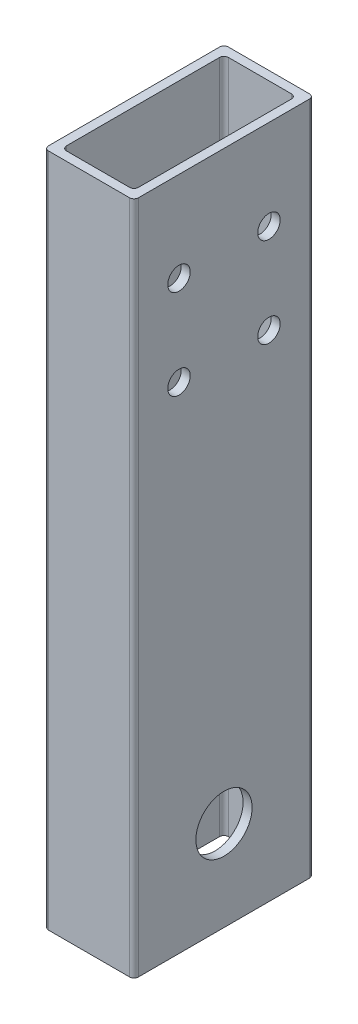
ISO-10303-21;
HEADER;
FILE_DESCRIPTION(('STEP AP214'),'2;1');
FILE_NAME('part.step','',(''),(''),'','','');
FILE_SCHEMA(('AUTOMOTIVE_DESIGN { 1 0 10303 214 1 1 1 1 }'));
ENDSEC;
DATA;
#1=APPLICATION_CONTEXT('core data for automotive mechanical design processes');
#2=APPLICATION_PROTOCOL_DEFINITION('international standard','automotive_design',2000,#1);
#3=PRODUCT_CONTEXT('',#1,'mechanical');
#4=PRODUCT('Part','Part','',(#3));
#5=PRODUCT_RELATED_PRODUCT_CATEGORY('part','',(#4));
#6=PRODUCT_DEFINITION_FORMATION('','',#4);
#7=PRODUCT_DEFINITION_CONTEXT('part definition',#1,'design');
#8=PRODUCT_DEFINITION('design','',#6,#7);
#9=PRODUCT_DEFINITION_SHAPE('','',#8);
#10=(LENGTH_UNIT() NAMED_UNIT(*) SI_UNIT(.MILLI.,.METRE.));
#11=(NAMED_UNIT(*) PLANE_ANGLE_UNIT() SI_UNIT($,.RADIAN.));
#12=(NAMED_UNIT(*) SI_UNIT($,.STERADIAN.) SOLID_ANGLE_UNIT());
#13=UNCERTAINTY_MEASURE_WITH_UNIT(LENGTH_MEASURE(1.E-05),#10,'distance_accuracy_value','');
#14=(GEOMETRIC_REPRESENTATION_CONTEXT(3) GLOBAL_UNCERTAINTY_ASSIGNED_CONTEXT((#13)) GLOBAL_UNIT_ASSIGNED_CONTEXT((#10,
#11,#12)) REPRESENTATION_CONTEXT('',''));
#15=CARTESIAN_POINT('',(0.,0.,0.));
#16=DIRECTION('',(0.,0.,1.));
#17=DIRECTION('',(1.,0.,0.));
#18=AXIS2_PLACEMENT_3D('',#15,#16,#17);
#19=CARTESIAN_POINT('',(2.,300.,-2.));
#20=DIRECTION('',(0.,-1.,0.));
#21=DIRECTION('',(0.,0.,-1.));
#22=AXIS2_PLACEMENT_3D('',#19,#20,#21);
#23=PLANE('',#22);
#24=CARTESIAN_POINT('',(2.,300.,-2.));
#25=DIRECTION('',(0.,1.,0.));
#26=DIRECTION('',(0.,0.,-1.));
#27=AXIS2_PLACEMENT_3D('',#24,#25,#26);
#28=CIRCLE('',#27,2.);
#29=CARTESIAN_POINT('',(0.,300.,-2.00000000000001));
#30=VERTEX_POINT('',#29);
#31=CARTESIAN_POINT('',(2.00000000000001,300.,0.));
#32=VERTEX_POINT('',#31);
#33=EDGE_CURVE('E219',#30,#32,#28,.T.);
#34=ORIENTED_EDGE('',*,*,#33,.T.);
#35=DIRECTION('',(1.,0.,0.));
#36=VECTOR('',#35,1.);
#37=CARTESIAN_POINT('',(2.00000000000001,300.,0.));
#38=LINE('',#37,#36);
#39=CARTESIAN_POINT('',(38.,300.,0.));
#40=VERTEX_POINT('',#39);
#41=EDGE_CURVE('E222',#32,#40,#38,.T.);
#42=ORIENTED_EDGE('',*,*,#41,.T.);
#43=CARTESIAN_POINT('',(38.,300.,-2.));
#44=DIRECTION('',(0.,1.,0.));
#45=DIRECTION('',(0.,0.,-1.));
#46=AXIS2_PLACEMENT_3D('',#43,#44,#45);
#47=CIRCLE('',#46,2.);
#48=CARTESIAN_POINT('',(40.,300.,-2.00000000000001));
#49=VERTEX_POINT('',#48);
#50=EDGE_CURVE('E225',#40,#49,#47,.T.);
#51=ORIENTED_EDGE('',*,*,#50,.T.);
#52=DIRECTION('',(0.,0.,-1.));
#53=VECTOR('',#52,1.);
#54=CARTESIAN_POINT('',(40.,300.,-2.00000000000001));
#55=LINE('',#54,#53);
#56=CARTESIAN_POINT('',(40.,300.,-78.));
#57=VERTEX_POINT('',#56);
#58=EDGE_CURVE('E227',#49,#57,#55,.T.);
#59=ORIENTED_EDGE('',*,*,#58,.T.);
#60=CARTESIAN_POINT('',(38.,300.,-78.));
#61=DIRECTION('',(0.,1.,0.));
#62=DIRECTION('',(0.,0.,-1.));
#63=AXIS2_PLACEMENT_3D('',#60,#61,#62);
#64=CIRCLE('',#63,2.);
#65=CARTESIAN_POINT('',(38.,300.,-80.));
#66=VERTEX_POINT('',#65);
#67=EDGE_CURVE('E229',#57,#66,#64,.T.);
#68=ORIENTED_EDGE('',*,*,#67,.T.);
#69=DIRECTION('',(-1.,0.,0.));
#70=VECTOR('',#69,1.);
#71=CARTESIAN_POINT('',(2.,300.,-80.));
#72=LINE('',#71,#70);
#73=CARTESIAN_POINT('',(2.,300.,-80.));
#74=VERTEX_POINT('',#73);
#75=EDGE_CURVE('E231',#66,#74,#72,.T.);
#76=ORIENTED_EDGE('',*,*,#75,.T.);
#77=CARTESIAN_POINT('',(2.,300.,-78.));
#78=DIRECTION('',(0.,1.,0.));
#79=DIRECTION('',(0.,0.,-1.));
#80=AXIS2_PLACEMENT_3D('',#77,#78,#79);
#81=CIRCLE('',#80,2.);
#82=CARTESIAN_POINT('',(0.,300.,-78.));
#83=VERTEX_POINT('',#82);
#84=EDGE_CURVE('E233',#74,#83,#81,.T.);
#85=ORIENTED_EDGE('',*,*,#84,.T.);
#86=DIRECTION('',(0.,0.,1.));
#87=VECTOR('',#86,1.);
#88=CARTESIAN_POINT('',(0.,300.,-2.00000000000001));
#89=LINE('',#88,#87);
#90=EDGE_CURVE('E235',#83,#30,#89,.T.);
#91=ORIENTED_EDGE('',*,*,#90,.T.);
#92=EDGE_LOOP('',(#34,#42,#51,#59,#68,#76,#85,#91));
#93=FACE_BOUND('',#92,.T.);
#94=CARTESIAN_POINT('',(34.,300.,-6.));
#95=DIRECTION('',(0.,1.,0.));
#96=DIRECTION('',(0.,0.,1.));
#97=AXIS2_PLACEMENT_3D('',#94,#95,#96);
#98=CIRCLE('',#97,2.);
#99=CARTESIAN_POINT('',(34.,300.,-4.));
#100=VERTEX_POINT('',#99);
#101=CARTESIAN_POINT('',(36.,300.,-6.00000000000001));
#102=VERTEX_POINT('',#101);
#103=EDGE_CURVE('E152',#100,#102,#98,.T.);
#104=ORIENTED_EDGE('',*,*,#103,.F.);
#105=DIRECTION('',(1.,0.,0.));
#106=VECTOR('',#105,1.);
#107=CARTESIAN_POINT('',(6.00000000000001,300.,-4.));
#108=LINE('',#107,#106);
#109=CARTESIAN_POINT('',(6.00000000000001,300.,-4.));
#110=VERTEX_POINT('',#109);
#111=EDGE_CURVE('E186',#110,#100,#108,.T.);
#112=ORIENTED_EDGE('',*,*,#111,.F.);
#113=CARTESIAN_POINT('',(6.,300.,-6.));
#114=DIRECTION('',(0.,1.,0.));
#115=DIRECTION('',(0.,0.,1.));
#116=AXIS2_PLACEMENT_3D('',#113,#114,#115);
#117=CIRCLE('',#116,2.);
#118=CARTESIAN_POINT('',(4.,300.,-6.00000000000002));
#119=VERTEX_POINT('',#118);
#120=EDGE_CURVE('E184',#119,#110,#117,.T.);
#121=ORIENTED_EDGE('',*,*,#120,.F.);
#122=DIRECTION('',(0.,0.,1.));
#123=VECTOR('',#122,1.);
#124=CARTESIAN_POINT('',(4.,300.,-6.00000000000001));
#125=LINE('',#124,#123);
#126=CARTESIAN_POINT('',(4.,300.,-74.));
#127=VERTEX_POINT('',#126);
#128=EDGE_CURVE('E182',#127,#119,#125,.T.);
#129=ORIENTED_EDGE('',*,*,#128,.F.);
#130=CARTESIAN_POINT('',(6.,300.,-74.));
#131=DIRECTION('',(0.,1.,0.));
#132=DIRECTION('',(0.,0.,1.));
#133=AXIS2_PLACEMENT_3D('',#130,#131,#132);
#134=CIRCLE('',#133,2.);
#135=CARTESIAN_POINT('',(6.,300.,-76.));
#136=VERTEX_POINT('',#135);
#137=EDGE_CURVE('E180',#136,#127,#134,.T.);
#138=ORIENTED_EDGE('',*,*,#137,.F.);
#139=DIRECTION('',(-1.,0.,0.));
#140=VECTOR('',#139,1.);
#141=CARTESIAN_POINT('',(6.,300.,-76.));
#142=LINE('',#141,#140);
#143=CARTESIAN_POINT('',(34.,300.,-76.));
#144=VERTEX_POINT('',#143);
#145=EDGE_CURVE('E175',#144,#136,#142,.T.);
#146=ORIENTED_EDGE('',*,*,#145,.F.);
#147=CARTESIAN_POINT('',(34.,300.,-74.));
#148=DIRECTION('',(0.,1.,0.));
#149=DIRECTION('',(0.,0.,1.));
#150=AXIS2_PLACEMENT_3D('',#147,#148,#149);
#151=CIRCLE('',#150,2.);
#152=CARTESIAN_POINT('',(36.,300.,-74.));
#153=VERTEX_POINT('',#152);
#154=EDGE_CURVE('E173',#153,#144,#151,.T.);
#155=ORIENTED_EDGE('',*,*,#154,.F.);
#156=DIRECTION('',(0.,0.,-1.));
#157=VECTOR('',#156,1.);
#158=CARTESIAN_POINT('',(36.,300.,-6.00000000000001));
#159=LINE('',#158,#157);
#160=EDGE_CURVE('E160',#102,#153,#159,.T.);
#161=ORIENTED_EDGE('',*,*,#160,.F.);
#162=EDGE_LOOP('',(#104,#112,#121,#129,#138,#146,#155,#161));
#163=FACE_BOUND('',#162,.T.);
#164=ADVANCED_FACE('F37',(#93,#163),#23,.F.);
#165=CARTESIAN_POINT('',(2.,0.,-2.));
#166=DIRECTION('',(0.,-1.,0.));
#167=DIRECTION('',(0.,0.,-1.));
#168=AXIS2_PLACEMENT_3D('',#165,#166,#167);
#169=PLANE('',#168);
#170=CARTESIAN_POINT('',(2.,0.,-2.));
#171=DIRECTION('',(0.,1.,0.));
#172=DIRECTION('',(0.,0.,-1.));
#173=AXIS2_PLACEMENT_3D('',#170,#171,#172);
#174=CIRCLE('',#173,2.);
#175=CARTESIAN_POINT('',(0.,0.,-2.00000000000001));
#176=VERTEX_POINT('',#175);
#177=CARTESIAN_POINT('',(2.00000000000001,0.,0.));
#178=VERTEX_POINT('',#177);
#179=EDGE_CURVE('E168',#176,#178,#174,.T.);
#180=ORIENTED_EDGE('',*,*,#179,.F.);
#181=DIRECTION('',(0.,0.,1.));
#182=VECTOR('',#181,1.);
#183=CARTESIAN_POINT('',(0.,0.,-2.00000000000001));
#184=LINE('',#183,#182);
#185=CARTESIAN_POINT('',(0.,0.,-78.));
#186=VERTEX_POINT('',#185);
#187=EDGE_CURVE('E223',#186,#176,#184,.T.);
#188=ORIENTED_EDGE('',*,*,#187,.F.);
#189=CARTESIAN_POINT('',(2.,0.,-78.));
#190=DIRECTION('',(0.,1.,0.));
#191=DIRECTION('',(0.,0.,-1.));
#192=AXIS2_PLACEMENT_3D('',#189,#190,#191);
#193=CIRCLE('',#192,2.);
#194=CARTESIAN_POINT('',(2.,0.,-80.));
#195=VERTEX_POINT('',#194);
#196=EDGE_CURVE('E250',#195,#186,#193,.T.);
#197=ORIENTED_EDGE('',*,*,#196,.F.);
#198=DIRECTION('',(-1.,0.,0.));
#199=VECTOR('',#198,1.);
#200=CARTESIAN_POINT('',(2.,0.,-80.));
#201=LINE('',#200,#199);
#202=CARTESIAN_POINT('',(38.,0.,-80.));
#203=VERTEX_POINT('',#202);
#204=EDGE_CURVE('E248',#203,#195,#201,.T.);
#205=ORIENTED_EDGE('',*,*,#204,.F.);
#206=CARTESIAN_POINT('',(38.,0.,-78.));
#207=DIRECTION('',(0.,1.,0.));
#208=DIRECTION('',(0.,0.,-1.));
#209=AXIS2_PLACEMENT_3D('',#206,#207,#208);
#210=CIRCLE('',#209,2.);
#211=CARTESIAN_POINT('',(40.,0.,-78.));
#212=VERTEX_POINT('',#211);
#213=EDGE_CURVE('E246',#212,#203,#210,.T.);
#214=ORIENTED_EDGE('',*,*,#213,.F.);
#215=DIRECTION('',(0.,0.,-1.));
#216=VECTOR('',#215,1.);
#217=CARTESIAN_POINT('',(40.,0.,-2.00000000000001));
#218=LINE('',#217,#216);
#219=CARTESIAN_POINT('',(40.,0.,-2.00000000000001));
#220=VERTEX_POINT('',#219);
#221=EDGE_CURVE('E244',#220,#212,#218,.T.);
#222=ORIENTED_EDGE('',*,*,#221,.F.);
#223=CARTESIAN_POINT('',(38.,0.,-2.));
#224=DIRECTION('',(0.,1.,0.));
#225=DIRECTION('',(0.,0.,-1.));
#226=AXIS2_PLACEMENT_3D('',#223,#224,#225);
#227=CIRCLE('',#226,2.);
#228=CARTESIAN_POINT('',(38.,0.,0.));
#229=VERTEX_POINT('',#228);
#230=EDGE_CURVE('E242',#229,#220,#227,.T.);
#231=ORIENTED_EDGE('',*,*,#230,.F.);
#232=DIRECTION('',(1.,0.,0.));
#233=VECTOR('',#232,1.);
#234=CARTESIAN_POINT('',(2.00000000000001,0.,0.));
#235=LINE('',#234,#233);
#236=EDGE_CURVE('E240',#178,#229,#235,.T.);
#237=ORIENTED_EDGE('',*,*,#236,.F.);
#238=EDGE_LOOP('',(#180,#188,#197,#205,#214,#222,#231,#237));
#239=FACE_BOUND('',#238,.T.);
#240=DIRECTION('',(1.,0.,0.));
#241=VECTOR('',#240,1.);
#242=CARTESIAN_POINT('',(6.00000000000001,0.,-4.));
#243=LINE('',#242,#241);
#244=CARTESIAN_POINT('',(6.00000000000001,0.,-4.));
#245=VERTEX_POINT('',#244);
#246=CARTESIAN_POINT('',(34.,0.,-4.));
#247=VERTEX_POINT('',#246);
#248=EDGE_CURVE('E161',#245,#247,#243,.T.);
#249=ORIENTED_EDGE('',*,*,#248,.T.);
#250=CARTESIAN_POINT('',(34.,0.,-6.));
#251=DIRECTION('',(0.,1.,0.));
#252=DIRECTION('',(0.,0.,1.));
#253=AXIS2_PLACEMENT_3D('',#250,#251,#252);
#254=CIRCLE('',#253,2.);
#255=CARTESIAN_POINT('',(36.,0.,-6.00000000000001));
#256=VERTEX_POINT('',#255);
#257=EDGE_CURVE('E62',#247,#256,#254,.T.);
#258=ORIENTED_EDGE('',*,*,#257,.T.);
#259=DIRECTION('',(0.,0.,-1.));
#260=VECTOR('',#259,1.);
#261=CARTESIAN_POINT('',(36.,0.,-6.00000000000001));
#262=LINE('',#261,#260);
#263=CARTESIAN_POINT('',(36.,0.,-74.));
#264=VERTEX_POINT('',#263);
#265=EDGE_CURVE('E167',#256,#264,#262,.T.);
#266=ORIENTED_EDGE('',*,*,#265,.T.);
#267=CARTESIAN_POINT('',(34.,0.,-74.));
#268=DIRECTION('',(0.,1.,0.));
#269=DIRECTION('',(0.,0.,1.));
#270=AXIS2_PLACEMENT_3D('',#267,#268,#269);
#271=CIRCLE('',#270,2.);
#272=CARTESIAN_POINT('',(34.,0.,-76.));
#273=VERTEX_POINT('',#272);
#274=EDGE_CURVE('E191',#264,#273,#271,.T.);
#275=ORIENTED_EDGE('',*,*,#274,.T.);
#276=DIRECTION('',(-1.,0.,0.));
#277=VECTOR('',#276,1.);
#278=CARTESIAN_POINT('',(6.,0.,-76.));
#279=LINE('',#278,#277);
#280=CARTESIAN_POINT('',(6.,0.,-76.));
#281=VERTEX_POINT('',#280);
#282=EDGE_CURVE('E194',#273,#281,#279,.T.);
#283=ORIENTED_EDGE('',*,*,#282,.T.);
#284=CARTESIAN_POINT('',(6.,0.,-74.));
#285=DIRECTION('',(0.,1.,0.));
#286=DIRECTION('',(0.,0.,1.));
#287=AXIS2_PLACEMENT_3D('',#284,#285,#286);
#288=CIRCLE('',#287,2.);
#289=CARTESIAN_POINT('',(4.,0.,-74.));
#290=VERTEX_POINT('',#289);
#291=EDGE_CURVE('E197',#281,#290,#288,.T.);
#292=ORIENTED_EDGE('',*,*,#291,.T.);
#293=DIRECTION('',(0.,0.,1.));
#294=VECTOR('',#293,1.);
#295=CARTESIAN_POINT('',(4.,0.,-6.00000000000001));
#296=LINE('',#295,#294);
#297=CARTESIAN_POINT('',(4.,0.,-6.00000000000002));
#298=VERTEX_POINT('',#297);
#299=EDGE_CURVE('E200',#290,#298,#296,.T.);
#300=ORIENTED_EDGE('',*,*,#299,.T.);
#301=CARTESIAN_POINT('',(6.,0.,-6.));
#302=DIRECTION('',(0.,1.,0.));
#303=DIRECTION('',(0.,0.,1.));
#304=AXIS2_PLACEMENT_3D('',#301,#302,#303);
#305=CIRCLE('',#304,2.);
#306=EDGE_CURVE('E203',#298,#245,#305,.T.);
#307=ORIENTED_EDGE('',*,*,#306,.T.);
#308=EDGE_LOOP('',(#249,#258,#266,#275,#283,#292,#300,#307));
#309=FACE_BOUND('',#308,.T.);
#310=ADVANCED_FACE('F344',(#239,#309),#169,.T.);
#311=CARTESIAN_POINT('',(2.,300.,-2.));
#312=DIRECTION('',(0.,-1.,0.));
#313=DIRECTION('',(0.,0.,-1.));
#314=AXIS2_PLACEMENT_3D('',#311,#312,#313);
#315=CYLINDRICAL_SURFACE('',#314,2.);
#316=ORIENTED_EDGE('',*,*,#179,.T.);
#317=DIRECTION('',(0.,-1.,0.));
#318=VECTOR('',#317,1.);
#319=CARTESIAN_POINT('',(2.00000000000001,300.,0.));
#320=LINE('',#319,#318);
#321=EDGE_CURVE('E11',#32,#178,#320,.T.);
#322=ORIENTED_EDGE('',*,*,#321,.F.);
#323=ORIENTED_EDGE('',*,*,#33,.F.);
#324=DIRECTION('',(0.,-1.,0.));
#325=VECTOR('',#324,1.);
#326=CARTESIAN_POINT('',(0.,300.,-2.00000000000001));
#327=LINE('',#326,#325);
#328=EDGE_CURVE('E237',#30,#176,#327,.T.);
#329=ORIENTED_EDGE('',*,*,#328,.T.);
#330=EDGE_LOOP('',(#316,#322,#323,#329));
#331=FACE_BOUND('',#330,.T.);
#332=ADVANCED_FACE('F39',(#331),#315,.T.);
#333=CARTESIAN_POINT('',(2.00000000000001,300.,0.));
#334=DIRECTION('',(0.,0.,-1.));
#335=DIRECTION('',(-1.,0.,0.));
#336=AXIS2_PLACEMENT_3D('',#333,#334,#335);
#337=PLANE('',#336);
#338=ORIENTED_EDGE('',*,*,#236,.T.);
#339=DIRECTION('',(0.,-1.,0.));
#340=VECTOR('',#339,1.);
#341=CARTESIAN_POINT('',(38.,300.,0.));
#342=LINE('',#341,#340);
#343=EDGE_CURVE('E46',#40,#229,#342,.T.);
#344=ORIENTED_EDGE('',*,*,#343,.F.);
#345=ORIENTED_EDGE('',*,*,#41,.F.);
#346=ORIENTED_EDGE('',*,*,#321,.T.);
#347=EDGE_LOOP('',(#338,#344,#345,#346));
#348=FACE_BOUND('',#347,.T.);
#349=ADVANCED_FACE('F374',(#348),#337,.F.);
#350=CARTESIAN_POINT('',(38.,300.,-2.));
#351=DIRECTION('',(0.,-1.,0.));
#352=DIRECTION('',(0.,0.,-1.));
#353=AXIS2_PLACEMENT_3D('',#350,#351,#352);
#354=CYLINDRICAL_SURFACE('',#353,2.);
#355=ORIENTED_EDGE('',*,*,#230,.T.);
#356=DIRECTION('',(0.,-1.,0.));
#357=VECTOR('',#356,1.);
#358=CARTESIAN_POINT('',(40.,300.,-2.00000000000001));
#359=LINE('',#358,#357);
#360=EDGE_CURVE('E267',#49,#220,#359,.T.);
#361=ORIENTED_EDGE('',*,*,#360,.F.);
#362=ORIENTED_EDGE('',*,*,#50,.F.);
#363=ORIENTED_EDGE('',*,*,#343,.T.);
#364=EDGE_LOOP('',(#355,#361,#362,#363));
#365=FACE_BOUND('',#364,.T.);
#366=ADVANCED_FACE('F371',(#365),#354,.T.);
#367=CARTESIAN_POINT('',(40.,300.,-2.00000000000001));
#368=DIRECTION('',(-1.,0.,0.));
#369=DIRECTION('',(0.,0.,1.));
#370=AXIS2_PLACEMENT_3D('',#367,#368,#369);
#371=PLANE('',#370);
#372=CARTESIAN_POINT('',(40.,260.,-59.9999999999999));
#373=DIRECTION('',(1.,0.,0.));
#374=DIRECTION('',(0.,0.,-1.));
#375=AXIS2_PLACEMENT_3D('',#372,#373,#374);
#376=CIRCLE('',#375,5.00000000000001);
#377=CARTESIAN_POINT('',(40.,260.,-64.9999999999999));
#378=VERTEX_POINT('',#377);
#379=EDGE_CURVE('E475',#378,#378,#376,.T.);
#380=ORIENTED_EDGE('',*,*,#379,.F.);
#381=EDGE_LOOP('',(#380));
#382=FACE_BOUND('',#381,.T.);
#383=CARTESIAN_POINT('',(40.,260.,-19.9999999999999));
#384=DIRECTION('',(1.,0.,0.));
#385=DIRECTION('',(0.,0.,-1.));
#386=AXIS2_PLACEMENT_3D('',#383,#384,#385);
#387=CIRCLE('',#386,5.);
#388=CARTESIAN_POINT('',(40.,260.,-24.9999999999999));
#389=VERTEX_POINT('',#388);
#390=EDGE_CURVE('E295',#389,#389,#387,.T.);
#391=ORIENTED_EDGE('',*,*,#390,.F.);
#392=EDGE_LOOP('',(#391));
#393=FACE_BOUND('',#392,.T.);
#394=CARTESIAN_POINT('',(40.,220.,-20.));
#395=DIRECTION('',(1.,0.,0.));
#396=DIRECTION('',(0.,0.,-1.));
#397=AXIS2_PLACEMENT_3D('',#394,#395,#396);
#398=CIRCLE('',#397,5.);
#399=CARTESIAN_POINT('',(40.,220.,-25.));
#400=VERTEX_POINT('',#399);
#401=EDGE_CURVE('E292',#400,#400,#398,.T.);
#402=ORIENTED_EDGE('',*,*,#401,.F.);
#403=EDGE_LOOP('',(#402));
#404=FACE_BOUND('',#403,.T.);
#405=CARTESIAN_POINT('',(40.,220.,-60.));
#406=DIRECTION('',(1.,0.,0.));
#407=DIRECTION('',(0.,0.,-1.));
#408=AXIS2_PLACEMENT_3D('',#405,#406,#407);
#409=CIRCLE('',#408,5.00000000000001);
#410=CARTESIAN_POINT('',(40.,220.,-65.));
#411=VERTEX_POINT('',#410);
#412=EDGE_CURVE('E311',#411,#411,#409,.T.);
#413=ORIENTED_EDGE('',*,*,#412,.F.);
#414=EDGE_LOOP('',(#413));
#415=FACE_BOUND('',#414,.T.);
#416=CARTESIAN_POINT('',(40.,40.,-40.));
#417=DIRECTION('',(1.,0.,0.));
#418=DIRECTION('',(0.,0.,-1.));
#419=AXIS2_PLACEMENT_3D('',#416,#417,#418);
#420=CIRCLE('',#419,12.5);
#421=CARTESIAN_POINT('',(40.,40.,-52.5));
#422=VERTEX_POINT('',#421);
#423=EDGE_CURVE('E318',#422,#422,#420,.T.);
#424=ORIENTED_EDGE('',*,*,#423,.F.);
#425=EDGE_LOOP('',(#424));
#426=FACE_BOUND('',#425,.T.);
#427=ORIENTED_EDGE('',*,*,#221,.T.);
#428=DIRECTION('',(0.,-1.,0.));
#429=VECTOR('',#428,1.);
#430=CARTESIAN_POINT('',(40.,300.,-78.));
#431=LINE('',#430,#429);
#432=EDGE_CURVE('E264',#57,#212,#431,.T.);
#433=ORIENTED_EDGE('',*,*,#432,.F.);
#434=ORIENTED_EDGE('',*,*,#58,.F.);
#435=ORIENTED_EDGE('',*,*,#360,.T.);
#436=EDGE_LOOP('',(#427,#433,#434,#435));
#437=FACE_BOUND('',#436,.T.);
#438=ADVANCED_FACE('F367',(#382,#393,#404,#415,#426,#437),#371,.F.);
#439=CARTESIAN_POINT('',(38.,300.,-78.));
#440=DIRECTION('',(0.,-1.,0.));
#441=DIRECTION('',(0.,0.,-1.));
#442=AXIS2_PLACEMENT_3D('',#439,#440,#441);
#443=CYLINDRICAL_SURFACE('',#442,2.);
#444=ORIENTED_EDGE('',*,*,#213,.T.);
#445=DIRECTION('',(0.,-1.,0.));
#446=VECTOR('',#445,1.);
#447=CARTESIAN_POINT('',(38.,300.,-80.));
#448=LINE('',#447,#446);
#449=EDGE_CURVE('E261',#66,#203,#448,.T.);
#450=ORIENTED_EDGE('',*,*,#449,.F.);
#451=ORIENTED_EDGE('',*,*,#67,.F.);
#452=ORIENTED_EDGE('',*,*,#432,.T.);
#453=EDGE_LOOP('',(#444,#450,#451,#452));
#454=FACE_BOUND('',#453,.T.);
#455=ADVANCED_FACE('F363',(#454),#443,.T.);
#456=CARTESIAN_POINT('',(2.,300.,-80.));
#457=DIRECTION('',(0.,0.,1.));
#458=DIRECTION('',(1.,0.,0.));
#459=AXIS2_PLACEMENT_3D('',#456,#457,#458);
#460=PLANE('',#459);
#461=ORIENTED_EDGE('',*,*,#204,.T.);
#462=DIRECTION('',(0.,-1.,0.));
#463=VECTOR('',#462,1.);
#464=CARTESIAN_POINT('',(2.,300.,-80.));
#465=LINE('',#464,#463);
#466=EDGE_CURVE('E258',#74,#195,#465,.T.);
#467=ORIENTED_EDGE('',*,*,#466,.F.);
#468=ORIENTED_EDGE('',*,*,#75,.F.);
#469=ORIENTED_EDGE('',*,*,#449,.T.);
#470=EDGE_LOOP('',(#461,#467,#468,#469));
#471=FACE_BOUND('',#470,.T.);
#472=ADVANCED_FACE('F359',(#471),#460,.F.);
#473=CARTESIAN_POINT('',(2.,300.,-78.));
#474=DIRECTION('',(0.,-1.,0.));
#475=DIRECTION('',(0.,0.,-1.));
#476=AXIS2_PLACEMENT_3D('',#473,#474,#475);
#477=CYLINDRICAL_SURFACE('',#476,2.);
#478=ORIENTED_EDGE('',*,*,#196,.T.);
#479=DIRECTION('',(0.,-1.,0.));
#480=VECTOR('',#479,1.);
#481=CARTESIAN_POINT('',(0.,300.,-78.));
#482=LINE('',#481,#480);
#483=EDGE_CURVE('E255',#83,#186,#482,.T.);
#484=ORIENTED_EDGE('',*,*,#483,.F.);
#485=ORIENTED_EDGE('',*,*,#84,.F.);
#486=ORIENTED_EDGE('',*,*,#466,.T.);
#487=EDGE_LOOP('',(#478,#484,#485,#486));
#488=FACE_BOUND('',#487,.T.);
#489=ADVANCED_FACE('F355',(#488),#477,.T.);
#490=CARTESIAN_POINT('',(0.,300.,-2.00000000000001));
#491=DIRECTION('',(1.,0.,0.));
#492=DIRECTION('',(0.,0.,-1.));
#493=AXIS2_PLACEMENT_3D('',#490,#491,#492);
#494=PLANE('',#493);
#495=CARTESIAN_POINT('',(0.,260.,-59.9999999999999));
#496=DIRECTION('',(1.,0.,0.));
#497=DIRECTION('',(0.,0.,-1.));
#498=AXIS2_PLACEMENT_3D('',#495,#496,#497);
#499=CIRCLE('',#498,5.00000000000001);
#500=CARTESIAN_POINT('',(0.,260.,-64.9999999999999));
#501=VERTEX_POINT('',#500);
#502=EDGE_CURVE('E474',#501,#501,#499,.T.);
#503=ORIENTED_EDGE('',*,*,#502,.T.);
#504=EDGE_LOOP('',(#503));
#505=FACE_BOUND('',#504,.T.);
#506=CARTESIAN_POINT('',(0.,260.,-19.9999999999999));
#507=DIRECTION('',(1.,0.,0.));
#508=DIRECTION('',(0.,0.,-1.));
#509=AXIS2_PLACEMENT_3D('',#506,#507,#508);
#510=CIRCLE('',#509,5.);
#511=CARTESIAN_POINT('',(0.,260.,-24.9999999999999));
#512=VERTEX_POINT('',#511);
#513=EDGE_CURVE('E288',#512,#512,#510,.T.);
#514=ORIENTED_EDGE('',*,*,#513,.T.);
#515=EDGE_LOOP('',(#514));
#516=FACE_BOUND('',#515,.T.);
#517=CARTESIAN_POINT('',(0.,220.,-20.));
#518=DIRECTION('',(1.,0.,0.));
#519=DIRECTION('',(0.,0.,-1.));
#520=AXIS2_PLACEMENT_3D('',#517,#518,#519);
#521=CIRCLE('',#520,5.);
#522=CARTESIAN_POINT('',(0.,220.,-25.));
#523=VERTEX_POINT('',#522);
#524=EDGE_CURVE('E284',#523,#523,#521,.T.);
#525=ORIENTED_EDGE('',*,*,#524,.T.);
#526=EDGE_LOOP('',(#525));
#527=FACE_BOUND('',#526,.T.);
#528=CARTESIAN_POINT('',(0.,220.,-60.));
#529=DIRECTION('',(1.,0.,0.));
#530=DIRECTION('',(0.,0.,-1.));
#531=AXIS2_PLACEMENT_3D('',#528,#529,#530);
#532=CIRCLE('',#531,5.00000000000001);
#533=CARTESIAN_POINT('',(0.,220.,-65.));
#534=VERTEX_POINT('',#533);
#535=EDGE_CURVE('E280',#534,#534,#532,.T.);
#536=ORIENTED_EDGE('',*,*,#535,.T.);
#537=EDGE_LOOP('',(#536));
#538=FACE_BOUND('',#537,.T.);
#539=CARTESIAN_POINT('',(0.,40.,-40.));
#540=DIRECTION('',(1.,0.,0.));
#541=DIRECTION('',(0.,0.,-1.));
#542=AXIS2_PLACEMENT_3D('',#539,#540,#541);
#543=CIRCLE('',#542,12.5);
#544=CARTESIAN_POINT('',(0.,40.,-52.5));
#545=VERTEX_POINT('',#544);
#546=EDGE_CURVE('E275',#545,#545,#543,.T.);
#547=ORIENTED_EDGE('',*,*,#546,.T.);
#548=EDGE_LOOP('',(#547));
#549=FACE_BOUND('',#548,.T.);
#550=ORIENTED_EDGE('',*,*,#187,.T.);
#551=ORIENTED_EDGE('',*,*,#328,.F.);
#552=ORIENTED_EDGE('',*,*,#90,.F.);
#553=ORIENTED_EDGE('',*,*,#483,.T.);
#554=EDGE_LOOP('',(#550,#551,#552,#553));
#555=FACE_BOUND('',#554,.T.);
#556=ADVANCED_FACE('F339',(#505,#516,#527,#538,#549,#555),#494,.F.);
#557=CARTESIAN_POINT('',(34.,300.,-6.));
#558=DIRECTION('',(0.,-1.,0.));
#559=DIRECTION('',(0.,0.,-1.));
#560=AXIS2_PLACEMENT_3D('',#557,#558,#559);
#561=CYLINDRICAL_SURFACE('',#560,2.);
#562=ORIENTED_EDGE('',*,*,#257,.F.);
#563=DIRECTION('',(0.,-1.,0.));
#564=VECTOR('',#563,1.);
#565=CARTESIAN_POINT('',(34.,300.,-4.));
#566=LINE('',#565,#564);
#567=EDGE_CURVE('E156',#100,#247,#566,.T.);
#568=ORIENTED_EDGE('',*,*,#567,.F.);
#569=ORIENTED_EDGE('',*,*,#103,.T.);
#570=DIRECTION('',(0.,-1.,0.));
#571=VECTOR('',#570,1.);
#572=CARTESIAN_POINT('',(36.,300.,-6.00000000000001));
#573=LINE('',#572,#571);
#574=EDGE_CURVE('E155',#102,#256,#573,.T.);
#575=ORIENTED_EDGE('',*,*,#574,.T.);
#576=EDGE_LOOP('',(#562,#568,#569,#575));
#577=FACE_BOUND('',#576,.T.);
#578=ADVANCED_FACE('F154',(#577),#561,.F.);
#579=CARTESIAN_POINT('',(36.,300.,-6.00000000000001));
#580=DIRECTION('',(-1.,0.,0.));
#581=DIRECTION('',(0.,0.,1.));
#582=AXIS2_PLACEMENT_3D('',#579,#580,#581);
#583=PLANE('',#582);
#584=CARTESIAN_POINT('',(36.,260.,-59.9999999999999));
#585=DIRECTION('',(-1.,0.,0.));
#586=DIRECTION('',(0.,0.,1.));
#587=AXIS2_PLACEMENT_3D('',#584,#585,#586);
#588=CIRCLE('',#587,5.00000000000001);
#589=CARTESIAN_POINT('',(36.,260.,-54.9999999999999));
#590=VERTEX_POINT('',#589);
#591=EDGE_CURVE('E300',#590,#590,#588,.T.);
#592=ORIENTED_EDGE('',*,*,#591,.F.);
#593=EDGE_LOOP('',(#592));
#594=FACE_BOUND('',#593,.T.);
#595=CARTESIAN_POINT('',(36.,260.,-19.9999999999999));
#596=DIRECTION('',(-1.,0.,0.));
#597=DIRECTION('',(0.,0.,1.));
#598=AXIS2_PLACEMENT_3D('',#595,#596,#597);
#599=CIRCLE('',#598,5.);
#600=CARTESIAN_POINT('',(36.,260.,-14.9999999999999));
#601=VERTEX_POINT('',#600);
#602=EDGE_CURVE('E287',#601,#601,#599,.T.);
#603=ORIENTED_EDGE('',*,*,#602,.F.);
#604=EDGE_LOOP('',(#603));
#605=FACE_BOUND('',#604,.T.);
#606=CARTESIAN_POINT('',(36.,220.,-20.));
#607=DIRECTION('',(-1.,0.,0.));
#608=DIRECTION('',(0.,0.,1.));
#609=AXIS2_PLACEMENT_3D('',#606,#607,#608);
#610=CIRCLE('',#609,5.);
#611=CARTESIAN_POINT('',(36.,220.,-15.));
#612=VERTEX_POINT('',#611);
#613=EDGE_CURVE('E283',#612,#612,#610,.T.);
#614=ORIENTED_EDGE('',*,*,#613,.F.);
#615=EDGE_LOOP('',(#614));
#616=FACE_BOUND('',#615,.T.);
#617=CARTESIAN_POINT('',(36.,220.,-60.));
#618=DIRECTION('',(-1.,0.,0.));
#619=DIRECTION('',(0.,0.,1.));
#620=AXIS2_PLACEMENT_3D('',#617,#618,#619);
#621=CIRCLE('',#620,5.00000000000001);
#622=CARTESIAN_POINT('',(36.,220.,-55.));
#623=VERTEX_POINT('',#622);
#624=EDGE_CURVE('E279',#623,#623,#621,.T.);
#625=ORIENTED_EDGE('',*,*,#624,.F.);
#626=EDGE_LOOP('',(#625));
#627=FACE_BOUND('',#626,.T.);
#628=CARTESIAN_POINT('',(36.,40.,-40.));
#629=DIRECTION('',(-1.,0.,0.));
#630=DIRECTION('',(0.,0.,1.));
#631=AXIS2_PLACEMENT_3D('',#628,#629,#630);
#632=CIRCLE('',#631,12.5);
#633=CARTESIAN_POINT('',(36.,40.,-27.5));
#634=VERTEX_POINT('',#633);
#635=EDGE_CURVE('E189',#634,#634,#632,.T.);
#636=ORIENTED_EDGE('',*,*,#635,.F.);
#637=EDGE_LOOP('',(#636));
#638=FACE_BOUND('',#637,.T.);
#639=ORIENTED_EDGE('',*,*,#265,.F.);
#640=ORIENTED_EDGE('',*,*,#574,.F.);
#641=ORIENTED_EDGE('',*,*,#160,.T.);
#642=DIRECTION('',(0.,-1.,0.));
#643=VECTOR('',#642,1.);
#644=CARTESIAN_POINT('',(36.,300.,-74.));
#645=LINE('',#644,#643);
#646=EDGE_CURVE('E169',#153,#264,#645,.T.);
#647=ORIENTED_EDGE('',*,*,#646,.T.);
#648=EDGE_LOOP('',(#639,#640,#641,#647));
#649=FACE_BOUND('',#648,.T.);
#650=ADVANCED_FACE('F164',(#594,#605,#616,#627,#638,#649),#583,.T.);
#651=CARTESIAN_POINT('',(34.,300.,-74.));
#652=DIRECTION('',(0.,-1.,0.));
#653=DIRECTION('',(0.,0.,-1.));
#654=AXIS2_PLACEMENT_3D('',#651,#652,#653);
#655=CYLINDRICAL_SURFACE('',#654,2.);
#656=ORIENTED_EDGE('',*,*,#274,.F.);
#657=ORIENTED_EDGE('',*,*,#646,.F.);
#658=ORIENTED_EDGE('',*,*,#154,.T.);
#659=DIRECTION('',(0.,-1.,0.));
#660=VECTOR('',#659,1.);
#661=CARTESIAN_POINT('',(34.,300.,-76.));
#662=LINE('',#661,#660);
#663=EDGE_CURVE('E216',#144,#273,#662,.T.);
#664=ORIENTED_EDGE('',*,*,#663,.T.);
#665=EDGE_LOOP('',(#656,#657,#658,#664));
#666=FACE_BOUND('',#665,.T.);
#667=ADVANCED_FACE('F329',(#666),#655,.F.);
#668=CARTESIAN_POINT('',(6.,300.,-76.));
#669=DIRECTION('',(0.,0.,1.));
#670=DIRECTION('',(1.,0.,0.));
#671=AXIS2_PLACEMENT_3D('',#668,#669,#670);
#672=PLANE('',#671);
#673=ORIENTED_EDGE('',*,*,#282,.F.);
#674=ORIENTED_EDGE('',*,*,#663,.F.);
#675=ORIENTED_EDGE('',*,*,#145,.T.);
#676=DIRECTION('',(0.,-1.,0.));
#677=VECTOR('',#676,1.);
#678=CARTESIAN_POINT('',(6.,300.,-76.));
#679=LINE('',#678,#677);
#680=EDGE_CURVE('E214',#136,#281,#679,.T.);
#681=ORIENTED_EDGE('',*,*,#680,.T.);
#682=EDGE_LOOP('',(#673,#674,#675,#681));
#683=FACE_BOUND('',#682,.T.);
#684=ADVANCED_FACE('F336',(#683),#672,.T.);
#685=CARTESIAN_POINT('',(6.,300.,-74.));
#686=DIRECTION('',(0.,-1.,0.));
#687=DIRECTION('',(0.,0.,-1.));
#688=AXIS2_PLACEMENT_3D('',#685,#686,#687);
#689=CYLINDRICAL_SURFACE('',#688,2.);
#690=ORIENTED_EDGE('',*,*,#291,.F.);
#691=ORIENTED_EDGE('',*,*,#680,.F.);
#692=ORIENTED_EDGE('',*,*,#137,.T.);
#693=DIRECTION('',(0.,-1.,0.));
#694=VECTOR('',#693,1.);
#695=CARTESIAN_POINT('',(4.,300.,-74.));
#696=LINE('',#695,#694);
#697=EDGE_CURVE('E212',#127,#290,#696,.T.);
#698=ORIENTED_EDGE('',*,*,#697,.T.);
#699=EDGE_LOOP('',(#690,#691,#692,#698));
#700=FACE_BOUND('',#699,.T.);
#701=ADVANCED_FACE('F421',(#700),#689,.F.);
#702=CARTESIAN_POINT('',(4.,300.,-6.00000000000001));
#703=DIRECTION('',(1.,0.,0.));
#704=DIRECTION('',(0.,0.,-1.));
#705=AXIS2_PLACEMENT_3D('',#702,#703,#704);
#706=PLANE('',#705);
#707=CARTESIAN_POINT('',(4.,260.,-59.9999999999999));
#708=DIRECTION('',(1.,0.,0.));
#709=DIRECTION('',(0.,0.,-1.));
#710=AXIS2_PLACEMENT_3D('',#707,#708,#709);
#711=CIRCLE('',#710,5.00000000000001);
#712=CARTESIAN_POINT('',(4.,260.,-64.9999999999999));
#713=VERTEX_POINT('',#712);
#714=EDGE_CURVE('E41',#713,#713,#711,.T.);
#715=ORIENTED_EDGE('',*,*,#714,.F.);
#716=EDGE_LOOP('',(#715));
#717=FACE_BOUND('',#716,.T.);
#718=CARTESIAN_POINT('',(4.,260.,-19.9999999999999));
#719=DIRECTION('',(1.,0.,0.));
#720=DIRECTION('',(0.,0.,-1.));
#721=AXIS2_PLACEMENT_3D('',#718,#719,#720);
#722=CIRCLE('',#721,5.);
#723=CARTESIAN_POINT('',(4.,260.,-24.9999999999999));
#724=VERTEX_POINT('',#723);
#725=EDGE_CURVE('E285',#724,#724,#722,.T.);
#726=ORIENTED_EDGE('',*,*,#725,.F.);
#727=EDGE_LOOP('',(#726));
#728=FACE_BOUND('',#727,.T.);
#729=CARTESIAN_POINT('',(4.,220.,-20.));
#730=DIRECTION('',(1.,0.,0.));
#731=DIRECTION('',(0.,0.,-1.));
#732=AXIS2_PLACEMENT_3D('',#729,#730,#731);
#733=CIRCLE('',#732,5.);
#734=CARTESIAN_POINT('',(4.,220.,-25.));
#735=VERTEX_POINT('',#734);
#736=EDGE_CURVE('E281',#735,#735,#733,.T.);
#737=ORIENTED_EDGE('',*,*,#736,.F.);
#738=EDGE_LOOP('',(#737));
#739=FACE_BOUND('',#738,.T.);
#740=CARTESIAN_POINT('',(4.,220.,-60.));
#741=DIRECTION('',(1.,0.,0.));
#742=DIRECTION('',(0.,0.,-1.));
#743=AXIS2_PLACEMENT_3D('',#740,#741,#742);
#744=CIRCLE('',#743,5.00000000000001);
#745=CARTESIAN_POINT('',(4.,220.,-65.));
#746=VERTEX_POINT('',#745);
#747=EDGE_CURVE('E276',#746,#746,#744,.T.);
#748=ORIENTED_EDGE('',*,*,#747,.F.);
#749=EDGE_LOOP('',(#748));
#750=FACE_BOUND('',#749,.T.);
#751=CARTESIAN_POINT('',(4.,40.,-40.));
#752=DIRECTION('',(1.,0.,0.));
#753=DIRECTION('',(0.,0.,-1.));
#754=AXIS2_PLACEMENT_3D('',#751,#752,#753);
#755=CIRCLE('',#754,12.5);
#756=CARTESIAN_POINT('',(4.,40.,-52.5));
#757=VERTEX_POINT('',#756);
#758=EDGE_CURVE('E272',#757,#757,#755,.T.);
#759=ORIENTED_EDGE('',*,*,#758,.F.);
#760=EDGE_LOOP('',(#759));
#761=FACE_BOUND('',#760,.T.);
#762=ORIENTED_EDGE('',*,*,#299,.F.);
#763=ORIENTED_EDGE('',*,*,#697,.F.);
#764=ORIENTED_EDGE('',*,*,#128,.T.);
#765=DIRECTION('',(0.,-1.,0.));
#766=VECTOR('',#765,1.);
#767=CARTESIAN_POINT('',(4.,300.,-6.00000000000002));
#768=LINE('',#767,#766);
#769=EDGE_CURVE('E210',#119,#298,#768,.T.);
#770=ORIENTED_EDGE('',*,*,#769,.T.);
#771=EDGE_LOOP('',(#762,#763,#764,#770));
#772=FACE_BOUND('',#771,.T.);
#773=ADVANCED_FACE('F417',(#717,#728,#739,#750,#761,#772),#706,.T.);
#774=CARTESIAN_POINT('',(6.,300.,-6.));
#775=DIRECTION('',(0.,-1.,0.));
#776=DIRECTION('',(0.,0.,-1.));
#777=AXIS2_PLACEMENT_3D('',#774,#775,#776);
#778=CYLINDRICAL_SURFACE('',#777,2.);
#779=ORIENTED_EDGE('',*,*,#306,.F.);
#780=ORIENTED_EDGE('',*,*,#769,.F.);
#781=ORIENTED_EDGE('',*,*,#120,.T.);
#782=DIRECTION('',(0.,-1.,0.));
#783=VECTOR('',#782,1.);
#784=CARTESIAN_POINT('',(6.00000000000001,300.,-4.));
#785=LINE('',#784,#783);
#786=EDGE_CURVE('E54',#110,#245,#785,.T.);
#787=ORIENTED_EDGE('',*,*,#786,.T.);
#788=EDGE_LOOP('',(#779,#780,#781,#787));
#789=FACE_BOUND('',#788,.T.);
#790=ADVANCED_FACE('F414',(#789),#778,.F.);
#791=CARTESIAN_POINT('',(6.00000000000001,300.,-4.));
#792=DIRECTION('',(0.,0.,-1.));
#793=DIRECTION('',(-1.,0.,0.));
#794=AXIS2_PLACEMENT_3D('',#791,#792,#793);
#795=PLANE('',#794);
#796=ORIENTED_EDGE('',*,*,#248,.F.);
#797=ORIENTED_EDGE('',*,*,#786,.F.);
#798=ORIENTED_EDGE('',*,*,#111,.T.);
#799=ORIENTED_EDGE('',*,*,#567,.T.);
#800=EDGE_LOOP('',(#796,#797,#798,#799));
#801=FACE_BOUND('',#800,.T.);
#802=ADVANCED_FACE('F408',(#801),#795,.T.);
#803=CARTESIAN_POINT('',(0.,40.,-40.));
#804=DIRECTION('',(1.,0.,0.));
#805=DIRECTION('',(0.,0.,-1.));
#806=AXIS2_PLACEMENT_3D('',#803,#804,#805);
#807=CYLINDRICAL_SURFACE('',#806,12.5);
#808=ORIENTED_EDGE('',*,*,#758,.T.);
#809=EDGE_LOOP('',(#808));
#810=FACE_BOUND('',#809,.T.);
#811=ORIENTED_EDGE('',*,*,#546,.F.);
#812=EDGE_LOOP('',(#811));
#813=FACE_BOUND('',#812,.T.);
#814=ADVANCED_FACE('F441',(#810,#813),#807,.F.);
#815=ORIENTED_EDGE('',*,*,#635,.T.);
#816=EDGE_LOOP('',(#815));
#817=FACE_BOUND('',#816,.T.);
#818=ORIENTED_EDGE('',*,*,#423,.T.);
#819=EDGE_LOOP('',(#818));
#820=FACE_BOUND('',#819,.T.);
#821=ADVANCED_FACE('F325',(#817,#820),#807,.F.);
#822=CARTESIAN_POINT('',(0.,220.,-60.));
#823=DIRECTION('',(1.,0.,0.));
#824=DIRECTION('',(0.,0.,-1.));
#825=AXIS2_PLACEMENT_3D('',#822,#823,#824);
#826=CYLINDRICAL_SURFACE('',#825,5.00000000000001);
#827=ORIENTED_EDGE('',*,*,#747,.T.);
#828=EDGE_LOOP('',(#827));
#829=FACE_BOUND('',#828,.T.);
#830=ORIENTED_EDGE('',*,*,#535,.F.);
#831=EDGE_LOOP('',(#830));
#832=FACE_BOUND('',#831,.T.);
#833=ADVANCED_FACE('F445',(#829,#832),#826,.F.);
#834=ORIENTED_EDGE('',*,*,#624,.T.);
#835=EDGE_LOOP('',(#834));
#836=FACE_BOUND('',#835,.T.);
#837=ORIENTED_EDGE('',*,*,#412,.T.);
#838=EDGE_LOOP('',(#837));
#839=FACE_BOUND('',#838,.T.);
#840=ADVANCED_FACE('F448',(#836,#839),#826,.F.);
#841=CARTESIAN_POINT('',(0.,220.,-20.));
#842=DIRECTION('',(1.,0.,0.));
#843=DIRECTION('',(0.,0.,-1.));
#844=AXIS2_PLACEMENT_3D('',#841,#842,#843);
#845=CYLINDRICAL_SURFACE('',#844,5.);
#846=ORIENTED_EDGE('',*,*,#736,.T.);
#847=EDGE_LOOP('',(#846));
#848=FACE_BOUND('',#847,.T.);
#849=ORIENTED_EDGE('',*,*,#524,.F.);
#850=EDGE_LOOP('',(#849));
#851=FACE_BOUND('',#850,.T.);
#852=ADVANCED_FACE('F450',(#848,#851),#845,.F.);
#853=ORIENTED_EDGE('',*,*,#613,.T.);
#854=EDGE_LOOP('',(#853));
#855=FACE_BOUND('',#854,.T.);
#856=ORIENTED_EDGE('',*,*,#401,.T.);
#857=EDGE_LOOP('',(#856));
#858=FACE_BOUND('',#857,.T.);
#859=ADVANCED_FACE('F453',(#855,#858),#845,.F.);
#860=CARTESIAN_POINT('',(0.,260.,-19.9999999999999));
#861=DIRECTION('',(1.,0.,0.));
#862=DIRECTION('',(0.,0.,-1.));
#863=AXIS2_PLACEMENT_3D('',#860,#861,#862);
#864=CYLINDRICAL_SURFACE('',#863,5.);
#865=ORIENTED_EDGE('',*,*,#725,.T.);
#866=EDGE_LOOP('',(#865));
#867=FACE_BOUND('',#866,.T.);
#868=ORIENTED_EDGE('',*,*,#513,.F.);
#869=EDGE_LOOP('',(#868));
#870=FACE_BOUND('',#869,.T.);
#871=ADVANCED_FACE('F455',(#867,#870),#864,.F.);
#872=ORIENTED_EDGE('',*,*,#602,.T.);
#873=EDGE_LOOP('',(#872));
#874=FACE_BOUND('',#873,.T.);
#875=ORIENTED_EDGE('',*,*,#390,.T.);
#876=EDGE_LOOP('',(#875));
#877=FACE_BOUND('',#876,.T.);
#878=ADVANCED_FACE('F458',(#874,#877),#864,.F.);
#879=CARTESIAN_POINT('',(0.,260.,-59.9999999999999));
#880=DIRECTION('',(1.,0.,0.));
#881=DIRECTION('',(0.,0.,-1.));
#882=AXIS2_PLACEMENT_3D('',#879,#880,#881);
#883=CYLINDRICAL_SURFACE('',#882,5.00000000000001);
#884=ORIENTED_EDGE('',*,*,#714,.T.);
#885=EDGE_LOOP('',(#884));
#886=FACE_BOUND('',#885,.T.);
#887=ORIENTED_EDGE('',*,*,#502,.F.);
#888=EDGE_LOOP('',(#887));
#889=FACE_BOUND('',#888,.T.);
#890=ADVANCED_FACE('F459',(#886,#889),#883,.F.);
#891=ORIENTED_EDGE('',*,*,#591,.T.);
#892=EDGE_LOOP('',(#891));
#893=FACE_BOUND('',#892,.T.);
#894=ORIENTED_EDGE('',*,*,#379,.T.);
#895=EDGE_LOOP('',(#894));
#896=FACE_BOUND('',#895,.T.);
#897=ADVANCED_FACE('F461',(#893,#896),#883,.F.);
#898=CLOSED_SHELL('',(#164,#310,#332,#349,#366,#438,#455,#472,#489,#556,#578,#650,#667,#684,
#701,#773,#790,#802,#814,#821,#833,#840,#852,#859,#871,#878,#890,#897));
#899=MANIFOLD_SOLID_BREP('B2',#898);
#900=ADVANCED_BREP_SHAPE_REPRESENTATION('',(#18,#899),#14);
#901=SHAPE_DEFINITION_REPRESENTATION(#9,#900);
ENDSEC;
END-ISO-10303-21;
